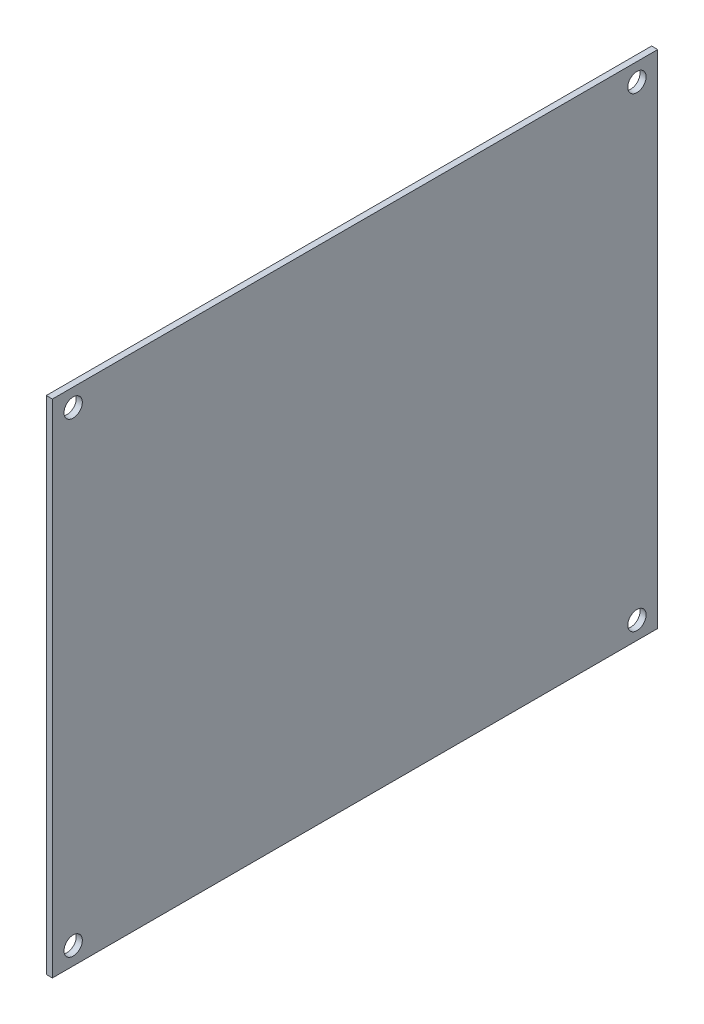
ISO-10303-21;
HEADER;
FILE_DESCRIPTION(('STEP AP214'),'2;1');
FILE_NAME('part.step','',(''),(''),'','','');
FILE_SCHEMA(('AUTOMOTIVE_DESIGN { 1 0 10303 214 1 1 1 1 }'));
ENDSEC;
DATA;
#1=APPLICATION_CONTEXT('core data for automotive mechanical design processes');
#2=APPLICATION_PROTOCOL_DEFINITION('international standard','automotive_design',2000,#1);
#3=PRODUCT_CONTEXT('',#1,'mechanical');
#4=PRODUCT('Part','Part','',(#3));
#5=PRODUCT_RELATED_PRODUCT_CATEGORY('part','',(#4));
#6=PRODUCT_DEFINITION_FORMATION('','',#4);
#7=PRODUCT_DEFINITION_CONTEXT('part definition',#1,'design');
#8=PRODUCT_DEFINITION('design','',#6,#7);
#9=PRODUCT_DEFINITION_SHAPE('','',#8);
#10=(LENGTH_UNIT() NAMED_UNIT(*) SI_UNIT(.MILLI.,.METRE.));
#11=(NAMED_UNIT(*) PLANE_ANGLE_UNIT() SI_UNIT($,.RADIAN.));
#12=(NAMED_UNIT(*) SI_UNIT($,.STERADIAN.) SOLID_ANGLE_UNIT());
#13=UNCERTAINTY_MEASURE_WITH_UNIT(LENGTH_MEASURE(1.E-05),#10,'distance_accuracy_value','');
#14=(GEOMETRIC_REPRESENTATION_CONTEXT(3) GLOBAL_UNCERTAINTY_ASSIGNED_CONTEXT((#13)) GLOBAL_UNIT_ASSIGNED_CONTEXT((#10,
#11,#12)) REPRESENTATION_CONTEXT('',''));
#15=CARTESIAN_POINT('',(0.,0.,0.));
#16=DIRECTION('',(0.,0.,1.));
#17=DIRECTION('',(1.,0.,0.));
#18=AXIS2_PLACEMENT_3D('',#15,#16,#17);
#19=CARTESIAN_POINT('',(1.,0.,0.));
#20=DIRECTION('',(-1.,0.,0.));
#21=DIRECTION('',(0.,0.,1.));
#22=AXIS2_PLACEMENT_3D('',#19,#20,#21);
#23=PLANE('',#22);
#24=DIRECTION('',(0.,0.,-1.));
#25=VECTOR('',#24,1.);
#26=CARTESIAN_POINT('',(1.,0.,0.));
#27=LINE('',#26,#25);
#28=CARTESIAN_POINT('',(1.,0.,99.));
#29=VERTEX_POINT('',#28);
#30=CARTESIAN_POINT('',(1.,0.,0.));
#31=VERTEX_POINT('',#30);
#32=EDGE_CURVE('E93',#29,#31,#27,.T.);
#33=ORIENTED_EDGE('',*,*,#32,.T.);
#34=DIRECTION('',(0.,1.,0.));
#35=VECTOR('',#34,1.);
#36=CARTESIAN_POINT('',(1.,0.,0.));
#37=LINE('',#36,#35);
#38=CARTESIAN_POINT('',(1.,81.9999999999998,0.));
#39=VERTEX_POINT('',#38);
#40=EDGE_CURVE('E88',#31,#39,#37,.T.);
#41=ORIENTED_EDGE('',*,*,#40,.T.);
#42=DIRECTION('',(0.,0.,1.));
#43=VECTOR('',#42,1.);
#44=CARTESIAN_POINT('',(1.,81.9999999999998,0.));
#45=LINE('',#44,#43);
#46=CARTESIAN_POINT('',(1.,81.9999999999998,99.));
#47=VERTEX_POINT('',#46);
#48=EDGE_CURVE('E91',#39,#47,#45,.T.);
#49=ORIENTED_EDGE('',*,*,#48,.T.);
#50=DIRECTION('',(0.,-1.,0.));
#51=VECTOR('',#50,1.);
#52=CARTESIAN_POINT('',(1.,0.,99.));
#53=LINE('',#52,#51);
#54=EDGE_CURVE('E58',#47,#29,#53,.T.);
#55=ORIENTED_EDGE('',*,*,#54,.T.);
#56=EDGE_LOOP('',(#33,#41,#49,#55));
#57=FACE_BOUND('',#56,.T.);
#58=CARTESIAN_POINT('',(1.,2.9,3.4));
#59=DIRECTION('',(1.,0.,0.));
#60=DIRECTION('',(0.,0.,-1.));
#61=AXIS2_PLACEMENT_3D('',#58,#59,#60);
#62=CIRCLE('',#61,1.5);
#63=CARTESIAN_POINT('',(1.,2.9,1.9));
#64=VERTEX_POINT('',#63);
#65=EDGE_CURVE('E108',#64,#64,#62,.T.);
#66=ORIENTED_EDGE('',*,*,#65,.F.);
#67=EDGE_LOOP('',(#66));
#68=FACE_BOUND('',#67,.T.);
#69=CARTESIAN_POINT('',(1.,2.9,95.6));
#70=DIRECTION('',(1.,0.,0.));
#71=DIRECTION('',(0.,0.,-1.));
#72=AXIS2_PLACEMENT_3D('',#69,#70,#71);
#73=CIRCLE('',#72,1.5);
#74=CARTESIAN_POINT('',(1.,2.9,94.1));
#75=VERTEX_POINT('',#74);
#76=EDGE_CURVE('E123',#75,#75,#73,.T.);
#77=ORIENTED_EDGE('',*,*,#76,.F.);
#78=EDGE_LOOP('',(#77));
#79=FACE_BOUND('',#78,.T.);
#80=CARTESIAN_POINT('',(1.,79.1,95.6));
#81=DIRECTION('',(1.,0.,0.));
#82=DIRECTION('',(0.,0.,-1.));
#83=AXIS2_PLACEMENT_3D('',#80,#81,#82);
#84=CIRCLE('',#83,1.5);
#85=CARTESIAN_POINT('',(1.,79.1,94.1));
#86=VERTEX_POINT('',#85);
#87=EDGE_CURVE('E129',#86,#86,#84,.T.);
#88=ORIENTED_EDGE('',*,*,#87,.F.);
#89=EDGE_LOOP('',(#88));
#90=FACE_BOUND('',#89,.T.);
#91=CARTESIAN_POINT('',(1.,79.1,3.4));
#92=DIRECTION('',(1.,0.,0.));
#93=DIRECTION('',(0.,0.,-1.));
#94=AXIS2_PLACEMENT_3D('',#91,#92,#93);
#95=CIRCLE('',#94,1.5);
#96=CARTESIAN_POINT('',(1.,79.1,1.9));
#97=VERTEX_POINT('',#96);
#98=EDGE_CURVE('E135',#97,#97,#95,.T.);
#99=ORIENTED_EDGE('',*,*,#98,.F.);
#100=EDGE_LOOP('',(#99));
#101=FACE_BOUND('',#100,.T.);
#102=ADVANCED_FACE('F41',(#57,#68,#79,#90,#101),#23,.F.);
#103=CARTESIAN_POINT('',(0.,0.,0.));
#104=DIRECTION('',(-1.,0.,0.));
#105=DIRECTION('',(0.,0.,1.));
#106=AXIS2_PLACEMENT_3D('',#103,#104,#105);
#107=PLANE('',#106);
#108=CARTESIAN_POINT('',(0.,79.1,95.6));
#109=DIRECTION('',(1.,0.,0.));
#110=DIRECTION('',(0.,0.,-1.));
#111=AXIS2_PLACEMENT_3D('',#108,#109,#110);
#112=CIRCLE('',#111,1.5);
#113=CARTESIAN_POINT('',(0.,79.1,94.1));
#114=VERTEX_POINT('',#113);
#115=EDGE_CURVE('E132',#114,#114,#112,.T.);
#116=ORIENTED_EDGE('',*,*,#115,.T.);
#117=EDGE_LOOP('',(#116));
#118=FACE_BOUND('',#117,.T.);
#119=CARTESIAN_POINT('',(0.,2.9,3.4));
#120=DIRECTION('',(1.,0.,0.));
#121=DIRECTION('',(0.,0.,-1.));
#122=AXIS2_PLACEMENT_3D('',#119,#120,#121);
#123=CIRCLE('',#122,1.5);
#124=CARTESIAN_POINT('',(0.,2.9,1.9));
#125=VERTEX_POINT('',#124);
#126=EDGE_CURVE('E120',#125,#125,#123,.T.);
#127=ORIENTED_EDGE('',*,*,#126,.T.);
#128=EDGE_LOOP('',(#127));
#129=FACE_BOUND('',#128,.T.);
#130=DIRECTION('',(0.,0.,-1.));
#131=VECTOR('',#130,1.);
#132=CARTESIAN_POINT('',(0.,0.,0.));
#133=LINE('',#132,#131);
#134=CARTESIAN_POINT('',(0.,0.,99.));
#135=VERTEX_POINT('',#134);
#136=CARTESIAN_POINT('',(0.,0.,0.));
#137=VERTEX_POINT('',#136);
#138=EDGE_CURVE('E105',#135,#137,#133,.T.);
#139=ORIENTED_EDGE('',*,*,#138,.F.);
#140=DIRECTION('',(0.,-1.,0.));
#141=VECTOR('',#140,1.);
#142=CARTESIAN_POINT('',(0.,0.,99.));
#143=LINE('',#142,#141);
#144=CARTESIAN_POINT('',(0.,81.9999999999998,99.));
#145=VERTEX_POINT('',#144);
#146=EDGE_CURVE('E81',#145,#135,#143,.T.);
#147=ORIENTED_EDGE('',*,*,#146,.F.);
#148=DIRECTION('',(0.,0.,1.));
#149=VECTOR('',#148,1.);
#150=CARTESIAN_POINT('',(0.,81.9999999999998,0.));
#151=LINE('',#150,#149);
#152=CARTESIAN_POINT('',(0.,81.9999999999998,0.));
#153=VERTEX_POINT('',#152);
#154=EDGE_CURVE('E75',#153,#145,#151,.T.);
#155=ORIENTED_EDGE('',*,*,#154,.F.);
#156=DIRECTION('',(0.,1.,0.));
#157=VECTOR('',#156,1.);
#158=CARTESIAN_POINT('',(0.,0.,0.));
#159=LINE('',#158,#157);
#160=EDGE_CURVE('E97',#137,#153,#159,.T.);
#161=ORIENTED_EDGE('',*,*,#160,.F.);
#162=EDGE_LOOP('',(#139,#147,#155,#161));
#163=FACE_BOUND('',#162,.T.);
#164=CARTESIAN_POINT('',(0.,2.9,95.6));
#165=DIRECTION('',(1.,0.,0.));
#166=DIRECTION('',(0.,0.,-1.));
#167=AXIS2_PLACEMENT_3D('',#164,#165,#166);
#168=CIRCLE('',#167,1.5);
#169=CARTESIAN_POINT('',(0.,2.9,94.1));
#170=VERTEX_POINT('',#169);
#171=EDGE_CURVE('E126',#170,#170,#168,.T.);
#172=ORIENTED_EDGE('',*,*,#171,.T.);
#173=EDGE_LOOP('',(#172));
#174=FACE_BOUND('',#173,.T.);
#175=CARTESIAN_POINT('',(0.,79.1,3.4));
#176=DIRECTION('',(1.,0.,0.));
#177=DIRECTION('',(0.,0.,-1.));
#178=AXIS2_PLACEMENT_3D('',#175,#176,#177);
#179=CIRCLE('',#178,1.5);
#180=CARTESIAN_POINT('',(0.,79.1,1.9));
#181=VERTEX_POINT('',#180);
#182=EDGE_CURVE('E138',#181,#181,#179,.T.);
#183=ORIENTED_EDGE('',*,*,#182,.T.);
#184=EDGE_LOOP('',(#183));
#185=FACE_BOUND('',#184,.T.);
#186=ADVANCED_FACE('F116',(#118,#129,#163,#174,#185),#107,.T.);
#187=CARTESIAN_POINT('',(1.,0.,0.));
#188=DIRECTION('',(0.,1.,0.));
#189=DIRECTION('',(0.,0.,1.));
#190=AXIS2_PLACEMENT_3D('',#187,#188,#189);
#191=PLANE('',#190);
#192=ORIENTED_EDGE('',*,*,#138,.T.);
#193=DIRECTION('',(-1.,0.,0.));
#194=VECTOR('',#193,1.);
#195=CARTESIAN_POINT('',(1.,0.,0.));
#196=LINE('',#195,#194);
#197=EDGE_CURVE('E11',#31,#137,#196,.T.);
#198=ORIENTED_EDGE('',*,*,#197,.F.);
#199=ORIENTED_EDGE('',*,*,#32,.F.);
#200=DIRECTION('',(-1.,0.,0.));
#201=VECTOR('',#200,1.);
#202=CARTESIAN_POINT('',(1.,0.,99.));
#203=LINE('',#202,#201);
#204=EDGE_CURVE('E101',#29,#135,#203,.T.);
#205=ORIENTED_EDGE('',*,*,#204,.T.);
#206=EDGE_LOOP('',(#192,#198,#199,#205));
#207=FACE_BOUND('',#206,.T.);
#208=ADVANCED_FACE('F43',(#207),#191,.F.);
#209=CARTESIAN_POINT('',(1.,0.,0.));
#210=DIRECTION('',(0.,0.,1.));
#211=DIRECTION('',(1.,0.,0.));
#212=AXIS2_PLACEMENT_3D('',#209,#210,#211);
#213=PLANE('',#212);
#214=ORIENTED_EDGE('',*,*,#160,.T.);
#215=DIRECTION('',(-1.,0.,0.));
#216=VECTOR('',#215,1.);
#217=CARTESIAN_POINT('',(1.,81.9999999999998,0.));
#218=LINE('',#217,#216);
#219=EDGE_CURVE('E50',#39,#153,#218,.T.);
#220=ORIENTED_EDGE('',*,*,#219,.F.);
#221=ORIENTED_EDGE('',*,*,#40,.F.);
#222=ORIENTED_EDGE('',*,*,#197,.T.);
#223=EDGE_LOOP('',(#214,#220,#221,#222));
#224=FACE_BOUND('',#223,.T.);
#225=ADVANCED_FACE('F96',(#224),#213,.F.);
#226=CARTESIAN_POINT('',(1.,81.9999999999998,0.));
#227=DIRECTION('',(0.,-1.,0.));
#228=DIRECTION('',(0.,0.,-1.));
#229=AXIS2_PLACEMENT_3D('',#226,#227,#228);
#230=PLANE('',#229);
#231=ORIENTED_EDGE('',*,*,#154,.T.);
#232=DIRECTION('',(-1.,0.,0.));
#233=VECTOR('',#232,1.);
#234=CARTESIAN_POINT('',(1.,81.9999999999998,99.));
#235=LINE('',#234,#233);
#236=EDGE_CURVE('E98',#47,#145,#235,.T.);
#237=ORIENTED_EDGE('',*,*,#236,.F.);
#238=ORIENTED_EDGE('',*,*,#48,.F.);
#239=ORIENTED_EDGE('',*,*,#219,.T.);
#240=EDGE_LOOP('',(#231,#237,#238,#239));
#241=FACE_BOUND('',#240,.T.);
#242=ADVANCED_FACE('F99',(#241),#230,.F.);
#243=CARTESIAN_POINT('',(1.,0.,99.));
#244=DIRECTION('',(0.,0.,-1.));
#245=DIRECTION('',(-1.,0.,0.));
#246=AXIS2_PLACEMENT_3D('',#243,#244,#245);
#247=PLANE('',#246);
#248=ORIENTED_EDGE('',*,*,#146,.T.);
#249=ORIENTED_EDGE('',*,*,#204,.F.);
#250=ORIENTED_EDGE('',*,*,#54,.F.);
#251=ORIENTED_EDGE('',*,*,#236,.T.);
#252=EDGE_LOOP('',(#248,#249,#250,#251));
#253=FACE_BOUND('',#252,.T.);
#254=ADVANCED_FACE('F113',(#253),#247,.F.);
#255=CARTESIAN_POINT('',(1.,2.9,3.4));
#256=DIRECTION('',(-1.,0.,0.));
#257=DIRECTION('',(0.,0.,1.));
#258=AXIS2_PLACEMENT_3D('',#255,#256,#257);
#259=CYLINDRICAL_SURFACE('',#258,1.5);
#260=ORIENTED_EDGE('',*,*,#65,.T.);
#261=EDGE_LOOP('',(#260));
#262=FACE_BOUND('',#261,.T.);
#263=ORIENTED_EDGE('',*,*,#126,.F.);
#264=EDGE_LOOP('',(#263));
#265=FACE_BOUND('',#264,.T.);
#266=ADVANCED_FACE('F155',(#262,#265),#259,.F.);
#267=CARTESIAN_POINT('',(1.,2.9,95.6));
#268=DIRECTION('',(-1.,0.,0.));
#269=DIRECTION('',(0.,0.,1.));
#270=AXIS2_PLACEMENT_3D('',#267,#268,#269);
#271=CYLINDRICAL_SURFACE('',#270,1.5);
#272=ORIENTED_EDGE('',*,*,#76,.T.);
#273=EDGE_LOOP('',(#272));
#274=FACE_BOUND('',#273,.T.);
#275=ORIENTED_EDGE('',*,*,#171,.F.);
#276=EDGE_LOOP('',(#275));
#277=FACE_BOUND('',#276,.T.);
#278=ADVANCED_FACE('F200',(#274,#277),#271,.F.);
#279=CARTESIAN_POINT('',(1.,79.1,95.6));
#280=DIRECTION('',(-1.,0.,0.));
#281=DIRECTION('',(0.,0.,1.));
#282=AXIS2_PLACEMENT_3D('',#279,#280,#281);
#283=CYLINDRICAL_SURFACE('',#282,1.5);
#284=ORIENTED_EDGE('',*,*,#87,.T.);
#285=EDGE_LOOP('',(#284));
#286=FACE_BOUND('',#285,.T.);
#287=ORIENTED_EDGE('',*,*,#115,.F.);
#288=EDGE_LOOP('',(#287));
#289=FACE_BOUND('',#288,.T.);
#290=ADVANCED_FACE('F208',(#286,#289),#283,.F.);
#291=CARTESIAN_POINT('',(1.,79.1,3.4));
#292=DIRECTION('',(-1.,0.,0.));
#293=DIRECTION('',(0.,0.,1.));
#294=AXIS2_PLACEMENT_3D('',#291,#292,#293);
#295=CYLINDRICAL_SURFACE('',#294,1.5);
#296=ORIENTED_EDGE('',*,*,#98,.T.);
#297=EDGE_LOOP('',(#296));
#298=FACE_BOUND('',#297,.T.);
#299=ORIENTED_EDGE('',*,*,#182,.F.);
#300=EDGE_LOOP('',(#299));
#301=FACE_BOUND('',#300,.T.);
#302=ADVANCED_FACE('F144',(#298,#301),#295,.F.);
#303=CLOSED_SHELL('',(#102,#186,#208,#225,#242,#254,#266,#278,#290,#302));
#304=MANIFOLD_SOLID_BREP('B2',#303);
#305=ADVANCED_BREP_SHAPE_REPRESENTATION('',(#18,#304),#14);
#306=SHAPE_DEFINITION_REPRESENTATION(#9,#305);
ENDSEC;
END-ISO-10303-21;
